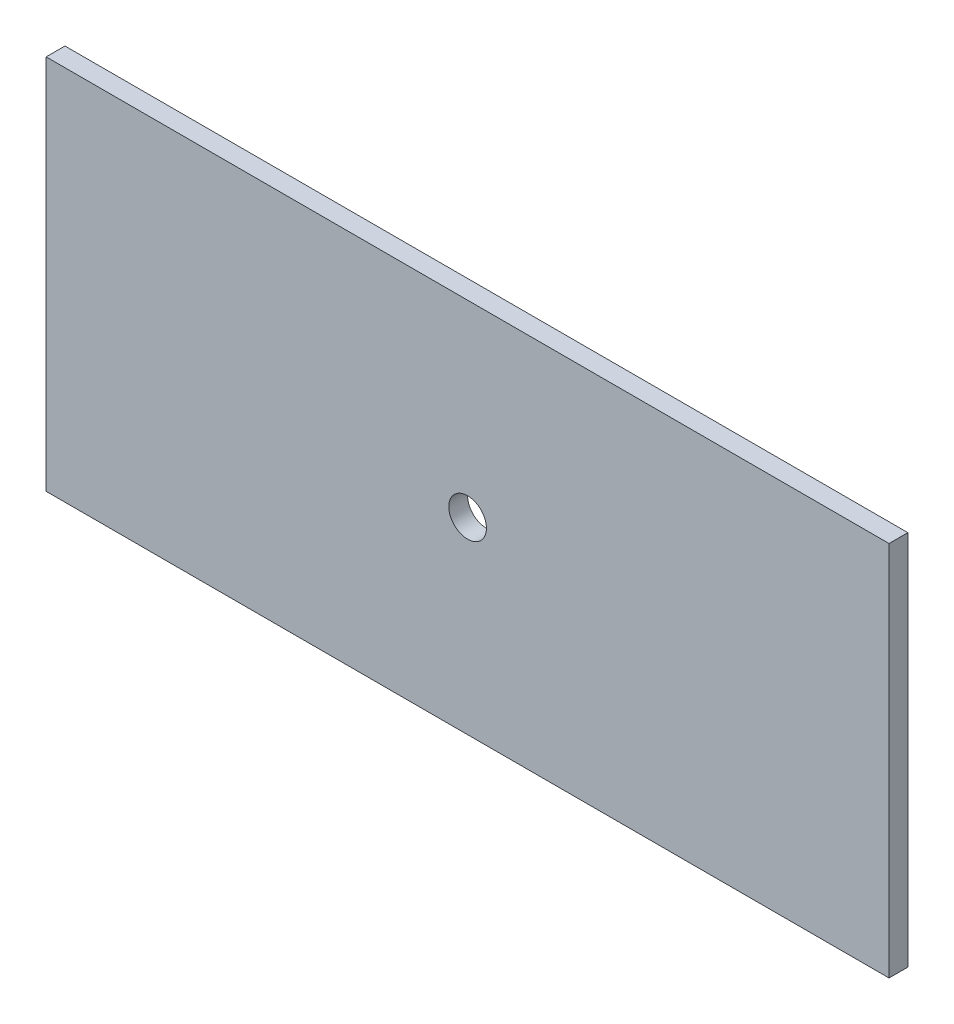
ISO-10303-21;
HEADER;
FILE_DESCRIPTION(('STEP AP214'),'2;1');
FILE_NAME('part.step','',(''),(''),'','','');
FILE_SCHEMA(('AUTOMOTIVE_DESIGN { 1 0 10303 214 1 1 1 1 }'));
ENDSEC;
DATA;
#1=APPLICATION_CONTEXT('core data for automotive mechanical design processes');
#2=APPLICATION_PROTOCOL_DEFINITION('international standard','automotive_design',2000,#1);
#3=PRODUCT_CONTEXT('',#1,'mechanical');
#4=PRODUCT('Part','Part','',(#3));
#5=PRODUCT_RELATED_PRODUCT_CATEGORY('part','',(#4));
#6=PRODUCT_DEFINITION_FORMATION('','',#4);
#7=PRODUCT_DEFINITION_CONTEXT('part definition',#1,'design');
#8=PRODUCT_DEFINITION('design','',#6,#7);
#9=PRODUCT_DEFINITION_SHAPE('','',#8);
#10=(LENGTH_UNIT() NAMED_UNIT(*) SI_UNIT(.MILLI.,.METRE.));
#11=(NAMED_UNIT(*) PLANE_ANGLE_UNIT() SI_UNIT($,.RADIAN.));
#12=(NAMED_UNIT(*) SI_UNIT($,.STERADIAN.) SOLID_ANGLE_UNIT());
#13=UNCERTAINTY_MEASURE_WITH_UNIT(LENGTH_MEASURE(1.E-05),#10,'distance_accuracy_value','');
#14=(GEOMETRIC_REPRESENTATION_CONTEXT(3) GLOBAL_UNCERTAINTY_ASSIGNED_CONTEXT((#13)) GLOBAL_UNIT_ASSIGNED_CONTEXT((#10,
#11,#12)) REPRESENTATION_CONTEXT('',''));
#15=CARTESIAN_POINT('',(0.,0.,0.));
#16=DIRECTION('',(0.,0.,1.));
#17=DIRECTION('',(1.,0.,0.));
#18=AXIS2_PLACEMENT_3D('',#15,#16,#17);
#19=CARTESIAN_POINT('',(142.24,-63.5,6.35));
#20=DIRECTION('',(-1.,0.,0.));
#21=DIRECTION('',(0.,0.,1.));
#22=AXIS2_PLACEMENT_3D('',#19,#20,#21);
#23=PLANE('',#22);
#24=DIRECTION('',(0.,1.,0.));
#25=VECTOR('',#24,1.);
#26=CARTESIAN_POINT('',(142.24,-63.5,0.));
#27=LINE('',#26,#25);
#28=CARTESIAN_POINT('',(142.24,-63.5,0.));
#29=VERTEX_POINT('',#28);
#30=CARTESIAN_POINT('',(142.24,63.5,0.));
#31=VERTEX_POINT('',#30);
#32=EDGE_CURVE('E113',#29,#31,#27,.T.);
#33=ORIENTED_EDGE('',*,*,#32,.T.);
#34=DIRECTION('',(0.,0.,-1.));
#35=VECTOR('',#34,1.);
#36=CARTESIAN_POINT('',(142.24,63.5,6.35));
#37=LINE('',#36,#35);
#38=CARTESIAN_POINT('',(142.24,63.5,6.35));
#39=VERTEX_POINT('',#38);
#40=EDGE_CURVE('E11',#39,#31,#37,.T.);
#41=ORIENTED_EDGE('',*,*,#40,.F.);
#42=DIRECTION('',(0.,1.,0.));
#43=VECTOR('',#42,1.);
#44=CARTESIAN_POINT('',(142.24,-63.5,6.35));
#45=LINE('',#44,#43);
#46=CARTESIAN_POINT('',(142.24,-63.5,6.35));
#47=VERTEX_POINT('',#46);
#48=EDGE_CURVE('E97',#47,#39,#45,.T.);
#49=ORIENTED_EDGE('',*,*,#48,.F.);
#50=DIRECTION('',(0.,0.,-1.));
#51=VECTOR('',#50,1.);
#52=CARTESIAN_POINT('',(142.24,-63.5,6.35));
#53=LINE('',#52,#51);
#54=EDGE_CURVE('E109',#47,#29,#53,.T.);
#55=ORIENTED_EDGE('',*,*,#54,.T.);
#56=EDGE_LOOP('',(#33,#41,#49,#55));
#57=FACE_BOUND('',#56,.T.);
#58=ADVANCED_FACE('F45',(#57),#23,.F.);
#59=CARTESIAN_POINT('',(-142.24,63.5,6.35));
#60=DIRECTION('',(0.,-1.,0.));
#61=DIRECTION('',(0.,0.,-1.));
#62=AXIS2_PLACEMENT_3D('',#59,#60,#61);
#63=PLANE('',#62);
#64=DIRECTION('',(-1.,0.,0.));
#65=VECTOR('',#64,1.);
#66=CARTESIAN_POINT('',(-142.24,63.5,0.));
#67=LINE('',#66,#65);
#68=CARTESIAN_POINT('',(-142.24,63.5,0.));
#69=VERTEX_POINT('',#68);
#70=EDGE_CURVE('E102',#31,#69,#67,.T.);
#71=ORIENTED_EDGE('',*,*,#70,.T.);
#72=DIRECTION('',(0.,0.,-1.));
#73=VECTOR('',#72,1.);
#74=CARTESIAN_POINT('',(-142.24,63.5,6.35));
#75=LINE('',#74,#73);
#76=CARTESIAN_POINT('',(-142.24,63.5,6.35));
#77=VERTEX_POINT('',#76);
#78=EDGE_CURVE('E54',#77,#69,#75,.T.);
#79=ORIENTED_EDGE('',*,*,#78,.F.);
#80=DIRECTION('',(-1.,0.,0.));
#81=VECTOR('',#80,1.);
#82=CARTESIAN_POINT('',(-142.24,63.5,6.35));
#83=LINE('',#82,#81);
#84=EDGE_CURVE('E92',#39,#77,#83,.T.);
#85=ORIENTED_EDGE('',*,*,#84,.F.);
#86=ORIENTED_EDGE('',*,*,#40,.T.);
#87=EDGE_LOOP('',(#71,#79,#85,#86));
#88=FACE_BOUND('',#87,.T.);
#89=ADVANCED_FACE('F101',(#88),#63,.F.);
#90=CARTESIAN_POINT('',(-142.24,-63.5,6.35));
#91=DIRECTION('',(1.,0.,0.));
#92=DIRECTION('',(0.,0.,-1.));
#93=AXIS2_PLACEMENT_3D('',#90,#91,#92);
#94=PLANE('',#93);
#95=DIRECTION('',(0.,-1.,0.));
#96=VECTOR('',#95,1.);
#97=CARTESIAN_POINT('',(-142.24,-63.5,0.));
#98=LINE('',#97,#96);
#99=CARTESIAN_POINT('',(-142.24,-63.5,0.));
#100=VERTEX_POINT('',#99);
#101=EDGE_CURVE('E79',#69,#100,#98,.T.);
#102=ORIENTED_EDGE('',*,*,#101,.T.);
#103=DIRECTION('',(0.,0.,-1.));
#104=VECTOR('',#103,1.);
#105=CARTESIAN_POINT('',(-142.24,-63.5,6.35));
#106=LINE('',#105,#104);
#107=CARTESIAN_POINT('',(-142.24,-63.5,6.35));
#108=VERTEX_POINT('',#107);
#109=EDGE_CURVE('E104',#108,#100,#106,.T.);
#110=ORIENTED_EDGE('',*,*,#109,.F.);
#111=DIRECTION('',(0.,-1.,0.));
#112=VECTOR('',#111,1.);
#113=CARTESIAN_POINT('',(-142.24,-63.5,6.35));
#114=LINE('',#113,#112);
#115=EDGE_CURVE('E95',#77,#108,#114,.T.);
#116=ORIENTED_EDGE('',*,*,#115,.F.);
#117=ORIENTED_EDGE('',*,*,#78,.T.);
#118=EDGE_LOOP('',(#102,#110,#116,#117));
#119=FACE_BOUND('',#118,.T.);
#120=ADVANCED_FACE('F105',(#119),#94,.F.);
#121=CARTESIAN_POINT('',(-142.24,-63.5,6.35));
#122=DIRECTION('',(0.,1.,0.));
#123=DIRECTION('',(0.,0.,1.));
#124=AXIS2_PLACEMENT_3D('',#121,#122,#123);
#125=PLANE('',#124);
#126=DIRECTION('',(1.,0.,0.));
#127=VECTOR('',#126,1.);
#128=CARTESIAN_POINT('',(-142.24,-63.5,0.));
#129=LINE('',#128,#127);
#130=EDGE_CURVE('E85',#100,#29,#129,.T.);
#131=ORIENTED_EDGE('',*,*,#130,.T.);
#132=ORIENTED_EDGE('',*,*,#54,.F.);
#133=DIRECTION('',(1.,0.,0.));
#134=VECTOR('',#133,1.);
#135=CARTESIAN_POINT('',(-142.24,-63.5,6.35));
#136=LINE('',#135,#134);
#137=EDGE_CURVE('E62',#108,#47,#136,.T.);
#138=ORIENTED_EDGE('',*,*,#137,.F.);
#139=ORIENTED_EDGE('',*,*,#109,.T.);
#140=EDGE_LOOP('',(#131,#132,#138,#139));
#141=FACE_BOUND('',#140,.T.);
#142=ADVANCED_FACE('F127',(#141),#125,.F.);
#143=CARTESIAN_POINT('',(0.,0.,6.35));
#144=DIRECTION('',(0.,0.,-1.));
#145=DIRECTION('',(-1.,0.,0.));
#146=AXIS2_PLACEMENT_3D('',#143,#144,#145);
#147=PLANE('',#146);
#148=CARTESIAN_POINT('',(0.,0.,6.35));
#149=DIRECTION('',(0.,0.,1.));
#150=DIRECTION('',(1.,0.,0.));
#151=AXIS2_PLACEMENT_3D('',#148,#149,#150);
#152=CIRCLE('',#151,6.35);
#153=CARTESIAN_POINT('',(6.35,0.,6.35));
#154=VERTEX_POINT('',#153);
#155=EDGE_CURVE('E134',#154,#154,#152,.T.);
#156=ORIENTED_EDGE('',*,*,#155,.F.);
#157=EDGE_LOOP('',(#156));
#158=FACE_BOUND('',#157,.T.);
#159=ORIENTED_EDGE('',*,*,#48,.T.);
#160=ORIENTED_EDGE('',*,*,#84,.T.);
#161=ORIENTED_EDGE('',*,*,#115,.T.);
#162=ORIENTED_EDGE('',*,*,#137,.T.);
#163=EDGE_LOOP('',(#159,#160,#161,#162));
#164=FACE_BOUND('',#163,.T.);
#165=ADVANCED_FACE('F93',(#158,#164),#147,.F.);
#166=CARTESIAN_POINT('',(0.,0.,0.));
#167=DIRECTION('',(0.,0.,-1.));
#168=DIRECTION('',(-1.,0.,0.));
#169=AXIS2_PLACEMENT_3D('',#166,#167,#168);
#170=PLANE('',#169);
#171=CARTESIAN_POINT('',(0.,0.,0.));
#172=DIRECTION('',(0.,0.,1.));
#173=DIRECTION('',(1.,0.,0.));
#174=AXIS2_PLACEMENT_3D('',#171,#172,#173);
#175=CIRCLE('',#174,6.35);
#176=CARTESIAN_POINT('',(6.35,0.,0.));
#177=VERTEX_POINT('',#176);
#178=EDGE_CURVE('E117',#177,#177,#175,.T.);
#179=ORIENTED_EDGE('',*,*,#178,.T.);
#180=EDGE_LOOP('',(#179));
#181=FACE_BOUND('',#180,.T.);
#182=ORIENTED_EDGE('',*,*,#32,.F.);
#183=ORIENTED_EDGE('',*,*,#130,.F.);
#184=ORIENTED_EDGE('',*,*,#101,.F.);
#185=ORIENTED_EDGE('',*,*,#70,.F.);
#186=EDGE_LOOP('',(#182,#183,#184,#185));
#187=FACE_BOUND('',#186,.T.);
#188=ADVANCED_FACE('F130',(#181,#187),#170,.T.);
#189=CARTESIAN_POINT('',(0.,0.,0.));
#190=DIRECTION('',(0.,0.,1.));
#191=DIRECTION('',(1.,0.,0.));
#192=AXIS2_PLACEMENT_3D('',#189,#190,#191);
#193=CYLINDRICAL_SURFACE('',#192,6.35);
#194=ORIENTED_EDGE('',*,*,#178,.F.);
#195=EDGE_LOOP('',(#194));
#196=FACE_BOUND('',#195,.T.);
#197=ORIENTED_EDGE('',*,*,#155,.T.);
#198=EDGE_LOOP('',(#197));
#199=FACE_BOUND('',#198,.T.);
#200=ADVANCED_FACE('F143',(#196,#199),#193,.F.);
#201=CLOSED_SHELL('',(#58,#89,#120,#142,#165,#188,#200));
#202=MANIFOLD_SOLID_BREP('B2',#201);
#203=ADVANCED_BREP_SHAPE_REPRESENTATION('',(#18,#202),#14);
#204=SHAPE_DEFINITION_REPRESENTATION(#9,#203);
ENDSEC;
END-ISO-10303-21;
